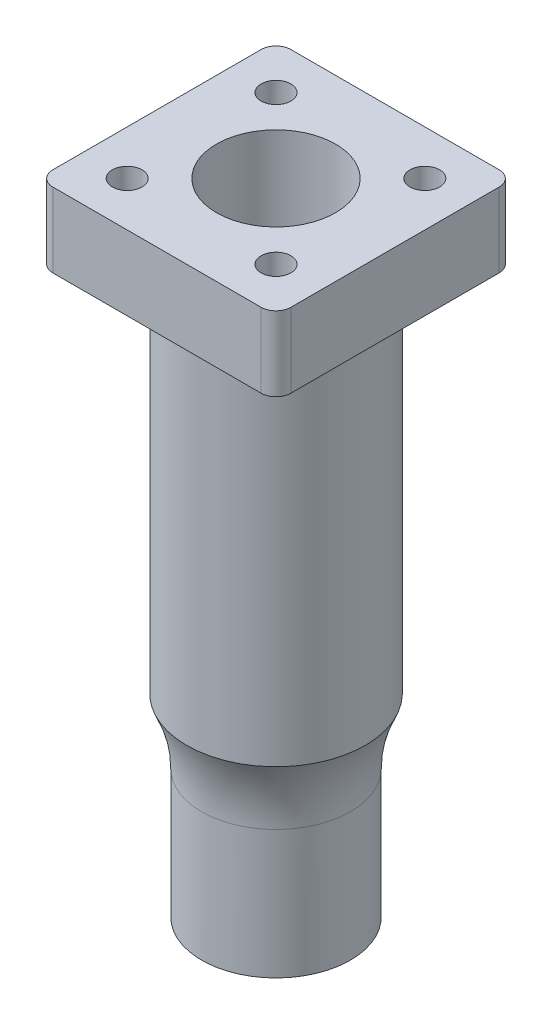
ISO-10303-21;
HEADER;
FILE_DESCRIPTION(('STEP AP214'),'2;1');
FILE_NAME('part.step','',(''),(''),'','','');
FILE_SCHEMA(('AUTOMOTIVE_DESIGN { 1 0 10303 214 1 1 1 1 }'));
ENDSEC;
DATA;
#1=APPLICATION_CONTEXT('core data for automotive mechanical design processes');
#2=APPLICATION_PROTOCOL_DEFINITION('international standard','automotive_design',2000,#1);
#3=PRODUCT_CONTEXT('',#1,'mechanical');
#4=PRODUCT('Part','Part','',(#3));
#5=PRODUCT_RELATED_PRODUCT_CATEGORY('part','',(#4));
#6=PRODUCT_DEFINITION_FORMATION('','',#4);
#7=PRODUCT_DEFINITION_CONTEXT('part definition',#1,'design');
#8=PRODUCT_DEFINITION('design','',#6,#7);
#9=PRODUCT_DEFINITION_SHAPE('','',#8);
#10=(LENGTH_UNIT() NAMED_UNIT(*) SI_UNIT(.MILLI.,.METRE.));
#11=(NAMED_UNIT(*) PLANE_ANGLE_UNIT() SI_UNIT($,.RADIAN.));
#12=(NAMED_UNIT(*) SI_UNIT($,.STERADIAN.) SOLID_ANGLE_UNIT());
#13=UNCERTAINTY_MEASURE_WITH_UNIT(LENGTH_MEASURE(1.E-05),#10,'distance_accuracy_value','');
#14=(GEOMETRIC_REPRESENTATION_CONTEXT(3) GLOBAL_UNCERTAINTY_ASSIGNED_CONTEXT((#13)) GLOBAL_UNIT_ASSIGNED_CONTEXT((#10,
#11,#12)) REPRESENTATION_CONTEXT('',''));
#15=CARTESIAN_POINT('',(0.,0.,0.));
#16=DIRECTION('',(0.,0.,1.));
#17=DIRECTION('',(1.,0.,0.));
#18=AXIS2_PLACEMENT_3D('',#15,#16,#17);
#19=CARTESIAN_POINT('',(0.,33.,0.));
#20=DIRECTION('',(0.,-1.,0.));
#21=DIRECTION('',(0.,0.,-1.));
#22=AXIS2_PLACEMENT_3D('',#19,#20,#21);
#23=CYLINDRICAL_SURFACE('',#22,6.);
#24=CARTESIAN_POINT('',(0.,3.,0.));
#25=DIRECTION('',(0.,1.,0.));
#26=DIRECTION('',(0.,0.,1.));
#27=AXIS2_PLACEMENT_3D('',#24,#25,#26);
#28=CIRCLE('',#27,6.);
#29=CARTESIAN_POINT('',(0.,3.,6.));
#30=VERTEX_POINT('',#29);
#31=EDGE_CURVE('E175',#30,#30,#28,.T.);
#32=ORIENTED_EDGE('',*,*,#31,.T.);
#33=EDGE_LOOP('',(#32));
#34=FACE_BOUND('',#33,.T.);
#35=CARTESIAN_POINT('',(0.,28.,0.));
#36=DIRECTION('',(0.,1.,0.));
#37=DIRECTION('',(0.,0.,1.));
#38=AXIS2_PLACEMENT_3D('',#35,#36,#37);
#39=CIRCLE('',#38,6.);
#40=CARTESIAN_POINT('',(0.,28.,6.));
#41=VERTEX_POINT('',#40);
#42=EDGE_CURVE('E11',#41,#41,#39,.T.);
#43=ORIENTED_EDGE('',*,*,#42,.F.);
#44=EDGE_LOOP('',(#43));
#45=FACE_BOUND('',#44,.T.);
#46=ADVANCED_FACE('F39',(#34,#45),#23,.T.);
#47=CARTESIAN_POINT('',(0.,3.,0.));
#48=DIRECTION('',(0.,1.,0.));
#49=DIRECTION('',(0.,0.,1.));
#50=AXIS2_PLACEMENT_3D('',#47,#48,#49);
#51=PLANE('',#50);
#52=CARTESIAN_POINT('',(0.,3.,0.));
#53=DIRECTION('',(0.,1.,0.));
#54=DIRECTION('',(0.,0.,1.));
#55=AXIS2_PLACEMENT_3D('',#52,#53,#54);
#56=CIRCLE('',#55,2.25);
#57=CARTESIAN_POINT('',(0.,3.,2.25));
#58=VERTEX_POINT('',#57);
#59=EDGE_CURVE('E188',#58,#58,#56,.T.);
#60=ORIENTED_EDGE('',*,*,#59,.F.);
#61=EDGE_LOOP('',(#60));
#62=FACE_BOUND('',#61,.T.);
#63=CARTESIAN_POINT('',(0.,3.,0.));
#64=DIRECTION('',(0.,1.,0.));
#65=DIRECTION('',(0.,0.,1.));
#66=AXIS2_PLACEMENT_3D('',#63,#64,#65);
#67=CIRCLE('',#66,4.);
#68=CARTESIAN_POINT('',(0.,3.,4.));
#69=VERTEX_POINT('',#68);
#70=EDGE_CURVE('E191',#69,#69,#67,.F.);
#71=ORIENTED_EDGE('',*,*,#70,.F.);
#72=EDGE_LOOP('',(#71));
#73=FACE_BOUND('',#72,.T.);
#74=ADVANCED_FACE('F209',(#62,#73),#51,.T.);
#75=CARTESIAN_POINT('',(0.,0.,0.));
#76=DIRECTION('',(0.,1.,0.));
#77=DIRECTION('',(0.,0.,1.));
#78=AXIS2_PLACEMENT_3D('',#75,#76,#77);
#79=PLANE('',#78);
#80=CARTESIAN_POINT('',(0.,0.,0.));
#81=DIRECTION('',(0.,1.,0.));
#82=DIRECTION('',(0.,0.,1.));
#83=AXIS2_PLACEMENT_3D('',#80,#81,#82);
#84=CIRCLE('',#83,2.25);
#85=CARTESIAN_POINT('',(0.,0.,2.25));
#86=VERTEX_POINT('',#85);
#87=EDGE_CURVE('E187',#86,#86,#84,.T.);
#88=ORIENTED_EDGE('',*,*,#87,.T.);
#89=EDGE_LOOP('',(#88));
#90=FACE_BOUND('',#89,.T.);
#91=CARTESIAN_POINT('',(0.,0.,0.));
#92=DIRECTION('',(0.,-1.,0.));
#93=DIRECTION('',(0.,0.,-1.));
#94=AXIS2_PLACEMENT_3D('',#91,#92,#93);
#95=CIRCLE('',#94,3.);
#96=CARTESIAN_POINT('',(0.,0.,-3.));
#97=VERTEX_POINT('',#96);
#98=EDGE_CURVE('E178',#97,#97,#95,.T.);
#99=ORIENTED_EDGE('',*,*,#98,.T.);
#100=EDGE_LOOP('',(#99));
#101=FACE_BOUND('',#100,.T.);
#102=ADVANCED_FACE('F268',(#90,#101),#79,.F.);
#103=CARTESIAN_POINT('',(0.,3.,0.));
#104=DIRECTION('',(0.,-1.,0.));
#105=DIRECTION('',(0.,0.,-1.));
#106=AXIS2_PLACEMENT_3D('',#103,#104,#105);
#107=CYLINDRICAL_SURFACE('',#106,5.);
#108=CARTESIAN_POINT('',(0.,-1.35889894354068,0.));
#109=DIRECTION('',(0.,1.,0.));
#110=DIRECTION('',(0.,0.,1.));
#111=AXIS2_PLACEMENT_3D('',#108,#109,#110);
#112=CIRCLE('',#111,5.);
#113=CARTESIAN_POINT('',(0.,-1.35889894354068,5.));
#114=VERTEX_POINT('',#113);
#115=EDGE_CURVE('E43',#114,#114,#112,.F.);
#116=ORIENTED_EDGE('',*,*,#115,.T.);
#117=EDGE_LOOP('',(#116));
#118=FACE_BOUND('',#117,.T.);
#119=CARTESIAN_POINT('',(0.,-10.,0.));
#120=DIRECTION('',(0.,-1.,0.));
#121=DIRECTION('',(0.,0.,-1.));
#122=AXIS2_PLACEMENT_3D('',#119,#120,#121);
#123=CIRCLE('',#122,5.);
#124=CARTESIAN_POINT('',(0.,-10.,-5.));
#125=VERTEX_POINT('',#124);
#126=EDGE_CURVE('E182',#125,#125,#123,.T.);
#127=ORIENTED_EDGE('',*,*,#126,.F.);
#128=EDGE_LOOP('',(#127));
#129=FACE_BOUND('',#128,.T.);
#130=ADVANCED_FACE('F199',(#118,#129),#107,.T.);
#131=CARTESIAN_POINT('',(0.,3.,0.));
#132=DIRECTION('',(0.,-1.,0.));
#133=DIRECTION('',(0.,0.,-1.));
#134=AXIS2_PLACEMENT_3D('',#131,#132,#133);
#135=CYLINDRICAL_SURFACE('',#134,2.25);
#136=ORIENTED_EDGE('',*,*,#59,.T.);
#137=EDGE_LOOP('',(#136));
#138=FACE_BOUND('',#137,.T.);
#139=ORIENTED_EDGE('',*,*,#87,.F.);
#140=EDGE_LOOP('',(#139));
#141=FACE_BOUND('',#140,.T.);
#142=ADVANCED_FACE('F261',(#138,#141),#135,.F.);
#143=CARTESIAN_POINT('',(0.,-10.,0.));
#144=DIRECTION('',(0.,-1.,0.));
#145=DIRECTION('',(0.,0.,-1.));
#146=AXIS2_PLACEMENT_3D('',#143,#144,#145);
#147=PLANE('',#146);
#148=ORIENTED_EDGE('',*,*,#126,.T.);
#149=EDGE_LOOP('',(#148));
#150=FACE_BOUND('',#149,.T.);
#151=CARTESIAN_POINT('',(0.,-10.,0.));
#152=DIRECTION('',(0.,-1.,0.));
#153=DIRECTION('',(0.,0.,-1.));
#154=AXIS2_PLACEMENT_3D('',#151,#152,#153);
#155=CIRCLE('',#154,3.);
#156=CARTESIAN_POINT('',(0.,-10.,-3.));
#157=VERTEX_POINT('',#156);
#158=EDGE_CURVE('E179',#157,#157,#155,.T.);
#159=ORIENTED_EDGE('',*,*,#158,.F.);
#160=EDGE_LOOP('',(#159));
#161=FACE_BOUND('',#160,.T.);
#162=ADVANCED_FACE('F257',(#150,#161),#147,.T.);
#163=CARTESIAN_POINT('',(0.,-10.,0.));
#164=DIRECTION('',(0.,1.,0.));
#165=DIRECTION('',(0.,0.,1.));
#166=AXIS2_PLACEMENT_3D('',#163,#164,#165);
#167=CYLINDRICAL_SURFACE('',#166,3.);
#168=ORIENTED_EDGE('',*,*,#158,.T.);
#169=EDGE_LOOP('',(#168));
#170=FACE_BOUND('',#169,.T.);
#171=ORIENTED_EDGE('',*,*,#98,.F.);
#172=EDGE_LOOP('',(#171));
#173=FACE_BOUND('',#172,.T.);
#174=ADVANCED_FACE('F252',(#170,#173),#167,.F.);
#175=CARTESIAN_POINT('',(0.,33.,0.));
#176=DIRECTION('',(0.,1.,0.));
#177=DIRECTION('',(0.,0.,1.));
#178=AXIS2_PLACEMENT_3D('',#175,#176,#177);
#179=PLANE('',#178);
#180=CARTESIAN_POINT('',(0.,33.,0.));
#181=DIRECTION('',(0.,1.,0.));
#182=DIRECTION('',(0.,0.,1.));
#183=AXIS2_PLACEMENT_3D('',#180,#181,#182);
#184=CIRCLE('',#183,4.);
#185=CARTESIAN_POINT('',(0.,33.,4.));
#186=VERTEX_POINT('',#185);
#187=EDGE_CURVE('E163',#186,#186,#184,.T.);
#188=ORIENTED_EDGE('',*,*,#187,.F.);
#189=EDGE_LOOP('',(#188));
#190=FACE_BOUND('',#189,.T.);
#191=DIRECTION('',(0.,0.,1.));
#192=VECTOR('',#191,1.);
#193=CARTESIAN_POINT('',(-8.,33.,0.));
#194=LINE('',#193,#192);
#195=CARTESIAN_POINT('',(-8.,33.,-7.));
#196=VERTEX_POINT('',#195);
#197=CARTESIAN_POINT('',(-8.,33.,7.));
#198=VERTEX_POINT('',#197);
#199=EDGE_CURVE('E160',#196,#198,#194,.T.);
#200=ORIENTED_EDGE('',*,*,#199,.T.);
#201=CARTESIAN_POINT('',(-7.,33.,7.));
#202=DIRECTION('',(0.,1.,0.));
#203=DIRECTION('',(0.,0.,-1.));
#204=AXIS2_PLACEMENT_3D('',#201,#202,#203);
#205=CIRCLE('',#204,1.);
#206=CARTESIAN_POINT('',(-7.,33.,8.));
#207=VERTEX_POINT('',#206);
#208=EDGE_CURVE('E142',#198,#207,#205,.T.);
#209=ORIENTED_EDGE('',*,*,#208,.T.);
#210=DIRECTION('',(1.,0.,0.));
#211=VECTOR('',#210,1.);
#212=CARTESIAN_POINT('',(7.,33.,8.));
#213=LINE('',#212,#211);
#214=CARTESIAN_POINT('',(7.,33.,8.));
#215=VERTEX_POINT('',#214);
#216=EDGE_CURVE('E145',#207,#215,#213,.T.);
#217=ORIENTED_EDGE('',*,*,#216,.T.);
#218=CARTESIAN_POINT('',(7.,33.,7.));
#219=DIRECTION('',(0.,1.,0.));
#220=DIRECTION('',(0.,0.,1.));
#221=AXIS2_PLACEMENT_3D('',#218,#219,#220);
#222=CIRCLE('',#221,1.);
#223=CARTESIAN_POINT('',(8.,33.,7.));
#224=VERTEX_POINT('',#223);
#225=EDGE_CURVE('E149',#215,#224,#222,.T.);
#226=ORIENTED_EDGE('',*,*,#225,.T.);
#227=DIRECTION('',(0.,0.,-1.));
#228=VECTOR('',#227,1.);
#229=CARTESIAN_POINT('',(8.,33.,-7.));
#230=LINE('',#229,#228);
#231=CARTESIAN_POINT('',(8.,33.,-7.));
#232=VERTEX_POINT('',#231);
#233=EDGE_CURVE('E152',#224,#232,#230,.T.);
#234=ORIENTED_EDGE('',*,*,#233,.T.);
#235=CARTESIAN_POINT('',(7.,33.,-7.));
#236=DIRECTION('',(0.,1.,0.));
#237=DIRECTION('',(0.,0.,1.));
#238=AXIS2_PLACEMENT_3D('',#235,#236,#237);
#239=CIRCLE('',#238,1.);
#240=CARTESIAN_POINT('',(7.,33.,-8.));
#241=VERTEX_POINT('',#240);
#242=EDGE_CURVE('E155',#232,#241,#239,.T.);
#243=ORIENTED_EDGE('',*,*,#242,.T.);
#244=DIRECTION('',(-1.,0.,0.));
#245=VECTOR('',#244,1.);
#246=CARTESIAN_POINT('',(-7.,33.,-8.));
#247=LINE('',#246,#245);
#248=CARTESIAN_POINT('',(-7.,33.,-8.));
#249=VERTEX_POINT('',#248);
#250=EDGE_CURVE('E119',#241,#249,#247,.T.);
#251=ORIENTED_EDGE('',*,*,#250,.T.);
#252=CARTESIAN_POINT('',(-7.,33.,-7.));
#253=DIRECTION('',(0.,1.,0.));
#254=DIRECTION('',(0.,0.,1.));
#255=AXIS2_PLACEMENT_3D('',#252,#253,#254);
#256=CIRCLE('',#255,1.);
#257=EDGE_CURVE('E158',#249,#196,#256,.T.);
#258=ORIENTED_EDGE('',*,*,#257,.T.);
#259=EDGE_LOOP('',(#200,#209,#217,#226,#234,#243,#251,#258));
#260=FACE_BOUND('',#259,.T.);
#261=CARTESIAN_POINT('',(-5.,33.,-5.));
#262=DIRECTION('',(0.,1.,0.));
#263=DIRECTION('',(0.,0.,1.));
#264=AXIS2_PLACEMENT_3D('',#261,#262,#263);
#265=CIRCLE('',#264,1.);
#266=CARTESIAN_POINT('',(-5.,33.,-4.));
#267=VERTEX_POINT('',#266);
#268=EDGE_CURVE('E452',#267,#267,#265,.T.);
#269=ORIENTED_EDGE('',*,*,#268,.F.);
#270=EDGE_LOOP('',(#269));
#271=FACE_BOUND('',#270,.T.);
#272=CARTESIAN_POINT('',(5.,33.,-5.));
#273=DIRECTION('',(0.,1.,0.));
#274=DIRECTION('',(0.,0.,1.));
#275=AXIS2_PLACEMENT_3D('',#272,#273,#274);
#276=CIRCLE('',#275,1.);
#277=CARTESIAN_POINT('',(5.,33.,-4.));
#278=VERTEX_POINT('',#277);
#279=EDGE_CURVE('E446',#278,#278,#276,.T.);
#280=ORIENTED_EDGE('',*,*,#279,.F.);
#281=EDGE_LOOP('',(#280));
#282=FACE_BOUND('',#281,.T.);
#283=CARTESIAN_POINT('',(-5.,33.,5.));
#284=DIRECTION('',(0.,1.,0.));
#285=DIRECTION('',(0.,0.,1.));
#286=AXIS2_PLACEMENT_3D('',#283,#284,#285);
#287=CIRCLE('',#286,1.);
#288=CARTESIAN_POINT('',(-5.,33.,6.));
#289=VERTEX_POINT('',#288);
#290=EDGE_CURVE('E440',#289,#289,#287,.T.);
#291=ORIENTED_EDGE('',*,*,#290,.F.);
#292=EDGE_LOOP('',(#291));
#293=FACE_BOUND('',#292,.T.);
#294=CARTESIAN_POINT('',(5.,33.,5.));
#295=DIRECTION('',(0.,1.,0.));
#296=DIRECTION('',(0.,0.,1.));
#297=AXIS2_PLACEMENT_3D('',#294,#295,#296);
#298=CIRCLE('',#297,1.);
#299=CARTESIAN_POINT('',(5.,33.,6.));
#300=VERTEX_POINT('',#299);
#301=EDGE_CURVE('E437',#300,#300,#298,.T.);
#302=ORIENTED_EDGE('',*,*,#301,.F.);
#303=EDGE_LOOP('',(#302));
#304=FACE_BOUND('',#303,.T.);
#305=ADVANCED_FACE('F249',(#190,#260,#271,#282,#293,#304),#179,.T.);
#306=CARTESIAN_POINT('',(0.,33.,0.));
#307=DIRECTION('',(0.,-1.,0.));
#308=DIRECTION('',(0.,0.,-1.));
#309=AXIS2_PLACEMENT_3D('',#306,#307,#308);
#310=CYLINDRICAL_SURFACE('',#309,4.);
#311=ORIENTED_EDGE('',*,*,#187,.T.);
#312=EDGE_LOOP('',(#311));
#313=FACE_BOUND('',#312,.T.);
#314=ORIENTED_EDGE('',*,*,#70,.T.);
#315=EDGE_LOOP('',(#314));
#316=FACE_BOUND('',#315,.T.);
#317=ADVANCED_FACE('F204',(#313,#316),#310,.F.);
#318=CARTESIAN_POINT('',(0.,-1.35889894354068,0.));
#319=DIRECTION('',(0.,1.,0.));
#320=DIRECTION('',(0.,0.,1.));
#321=AXIS2_PLACEMENT_3D('',#318,#319,#320);
#322=TOROIDAL_SURFACE('',#321,15.,10.);
#323=ORIENTED_EDGE('',*,*,#115,.F.);
#324=EDGE_LOOP('',(#323));
#325=FACE_BOUND('',#324,.T.);
#326=ORIENTED_EDGE('',*,*,#31,.F.);
#327=EDGE_LOOP('',(#326));
#328=FACE_BOUND('',#327,.T.);
#329=ADVANCED_FACE('F41',(#325,#328),#322,.F.);
#330=CARTESIAN_POINT('',(-7.,28.,-7.));
#331=DIRECTION('',(0.,1.,0.));
#332=DIRECTION('',(0.,0.,1.));
#333=AXIS2_PLACEMENT_3D('',#330,#331,#332);
#334=PLANE('',#333);
#335=DIRECTION('',(0.,0.,1.));
#336=VECTOR('',#335,1.);
#337=CARTESIAN_POINT('',(-8.,28.,7.));
#338=LINE('',#337,#336);
#339=CARTESIAN_POINT('',(-8.,28.,-7.));
#340=VERTEX_POINT('',#339);
#341=CARTESIAN_POINT('',(-8.,28.,7.));
#342=VERTEX_POINT('',#341);
#343=EDGE_CURVE('E57',#340,#342,#338,.T.);
#344=ORIENTED_EDGE('',*,*,#343,.F.);
#345=CARTESIAN_POINT('',(-7.,28.,-7.));
#346=DIRECTION('',(0.,1.,0.));
#347=DIRECTION('',(0.,0.,1.));
#348=AXIS2_PLACEMENT_3D('',#345,#346,#347);
#349=CIRCLE('',#348,1.);
#350=CARTESIAN_POINT('',(-7.,28.,-8.));
#351=VERTEX_POINT('',#350);
#352=EDGE_CURVE('E132',#351,#340,#349,.T.);
#353=ORIENTED_EDGE('',*,*,#352,.F.);
#354=DIRECTION('',(-1.,0.,0.));
#355=VECTOR('',#354,1.);
#356=CARTESIAN_POINT('',(-7.,28.,-8.));
#357=LINE('',#356,#355);
#358=CARTESIAN_POINT('',(7.,28.,-8.));
#359=VERTEX_POINT('',#358);
#360=EDGE_CURVE('E117',#359,#351,#357,.T.);
#361=ORIENTED_EDGE('',*,*,#360,.F.);
#362=CARTESIAN_POINT('',(7.,28.,-7.));
#363=DIRECTION('',(0.,1.,0.));
#364=DIRECTION('',(0.,0.,1.));
#365=AXIS2_PLACEMENT_3D('',#362,#363,#364);
#366=CIRCLE('',#365,1.);
#367=CARTESIAN_POINT('',(8.,28.,-7.));
#368=VERTEX_POINT('',#367);
#369=EDGE_CURVE('E130',#368,#359,#366,.T.);
#370=ORIENTED_EDGE('',*,*,#369,.F.);
#371=DIRECTION('',(0.,0.,-1.));
#372=VECTOR('',#371,1.);
#373=CARTESIAN_POINT('',(8.,28.,-7.));
#374=LINE('',#373,#372);
#375=CARTESIAN_POINT('',(8.,28.,7.));
#376=VERTEX_POINT('',#375);
#377=EDGE_CURVE('E135',#376,#368,#374,.T.);
#378=ORIENTED_EDGE('',*,*,#377,.F.);
#379=CARTESIAN_POINT('',(7.,28.,7.));
#380=DIRECTION('',(0.,1.,0.));
#381=DIRECTION('',(0.,0.,1.));
#382=AXIS2_PLACEMENT_3D('',#379,#380,#381);
#383=CIRCLE('',#382,1.);
#384=CARTESIAN_POINT('',(7.,28.,8.));
#385=VERTEX_POINT('',#384);
#386=EDGE_CURVE('E137',#385,#376,#383,.T.);
#387=ORIENTED_EDGE('',*,*,#386,.F.);
#388=DIRECTION('',(1.,0.,0.));
#389=VECTOR('',#388,1.);
#390=CARTESIAN_POINT('',(7.,28.,8.));
#391=LINE('',#390,#389);
#392=CARTESIAN_POINT('',(-7.,28.,8.));
#393=VERTEX_POINT('',#392);
#394=EDGE_CURVE('E462',#393,#385,#391,.T.);
#395=ORIENTED_EDGE('',*,*,#394,.F.);
#396=CARTESIAN_POINT('',(-7.,28.,7.));
#397=DIRECTION('',(0.,1.,0.));
#398=DIRECTION('',(0.,0.,-1.));
#399=AXIS2_PLACEMENT_3D('',#396,#397,#398);
#400=CIRCLE('',#399,1.);
#401=EDGE_CURVE('E460',#342,#393,#400,.T.);
#402=ORIENTED_EDGE('',*,*,#401,.F.);
#403=EDGE_LOOP('',(#344,#353,#361,#370,#378,#387,#395,#402));
#404=FACE_BOUND('',#403,.T.);
#405=CARTESIAN_POINT('',(-5.,28.,-5.));
#406=DIRECTION('',(0.,1.,0.));
#407=DIRECTION('',(0.,0.,1.));
#408=AXIS2_PLACEMENT_3D('',#405,#406,#407);
#409=CIRCLE('',#408,1.);
#410=CARTESIAN_POINT('',(-5.,28.,-4.));
#411=VERTEX_POINT('',#410);
#412=EDGE_CURVE('E146',#411,#411,#409,.T.);
#413=ORIENTED_EDGE('',*,*,#412,.T.);
#414=EDGE_LOOP('',(#413));
#415=FACE_BOUND('',#414,.T.);
#416=CARTESIAN_POINT('',(5.,28.,-5.));
#417=DIRECTION('',(0.,1.,0.));
#418=DIRECTION('',(0.,0.,1.));
#419=AXIS2_PLACEMENT_3D('',#416,#417,#418);
#420=CIRCLE('',#419,1.);
#421=CARTESIAN_POINT('',(5.,28.,-4.));
#422=VERTEX_POINT('',#421);
#423=EDGE_CURVE('E449',#422,#422,#420,.T.);
#424=ORIENTED_EDGE('',*,*,#423,.T.);
#425=EDGE_LOOP('',(#424));
#426=FACE_BOUND('',#425,.T.);
#427=CARTESIAN_POINT('',(-5.,28.,5.));
#428=DIRECTION('',(0.,1.,0.));
#429=DIRECTION('',(0.,0.,1.));
#430=AXIS2_PLACEMENT_3D('',#427,#428,#429);
#431=CIRCLE('',#430,1.);
#432=CARTESIAN_POINT('',(-5.,28.,6.));
#433=VERTEX_POINT('',#432);
#434=EDGE_CURVE('E443',#433,#433,#431,.T.);
#435=ORIENTED_EDGE('',*,*,#434,.T.);
#436=EDGE_LOOP('',(#435));
#437=FACE_BOUND('',#436,.T.);
#438=CARTESIAN_POINT('',(5.,28.,5.));
#439=DIRECTION('',(0.,1.,0.));
#440=DIRECTION('',(0.,0.,1.));
#441=AXIS2_PLACEMENT_3D('',#438,#439,#440);
#442=CIRCLE('',#441,1.);
#443=CARTESIAN_POINT('',(5.,28.,6.));
#444=VERTEX_POINT('',#443);
#445=EDGE_CURVE('E434',#444,#444,#442,.T.);
#446=ORIENTED_EDGE('',*,*,#445,.T.);
#447=EDGE_LOOP('',(#446));
#448=FACE_BOUND('',#447,.T.);
#449=ORIENTED_EDGE('',*,*,#42,.T.);
#450=EDGE_LOOP('',(#449));
#451=FACE_BOUND('',#450,.T.);
#452=ADVANCED_FACE('F127',(#404,#415,#426,#437,#448,#451),#334,.F.);
#453=CARTESIAN_POINT('',(-8.,28.,0.));
#454=DIRECTION('',(-1.,0.,0.));
#455=DIRECTION('',(0.,0.,1.));
#456=AXIS2_PLACEMENT_3D('',#453,#454,#455);
#457=PLANE('',#456);
#458=ORIENTED_EDGE('',*,*,#199,.F.);
#459=DIRECTION('',(0.,1.,0.));
#460=VECTOR('',#459,1.);
#461=CARTESIAN_POINT('',(-8.,28.,-7.));
#462=LINE('',#461,#460);
#463=EDGE_CURVE('E92',#340,#196,#462,.T.);
#464=ORIENTED_EDGE('',*,*,#463,.F.);
#465=ORIENTED_EDGE('',*,*,#343,.T.);
#466=DIRECTION('',(0.,1.,0.));
#467=VECTOR('',#466,1.);
#468=CARTESIAN_POINT('',(-8.,28.,7.));
#469=LINE('',#468,#467);
#470=EDGE_CURVE('E101',#342,#198,#469,.T.);
#471=ORIENTED_EDGE('',*,*,#470,.T.);
#472=EDGE_LOOP('',(#458,#464,#465,#471));
#473=FACE_BOUND('',#472,.T.);
#474=ADVANCED_FACE('F214',(#473),#457,.T.);
#475=CARTESIAN_POINT('',(-7.,28.,-7.));
#476=DIRECTION('',(0.,1.,0.));
#477=DIRECTION('',(0.,0.,1.));
#478=AXIS2_PLACEMENT_3D('',#475,#476,#477);
#479=CYLINDRICAL_SURFACE('',#478,1.);
#480=ORIENTED_EDGE('',*,*,#257,.F.);
#481=DIRECTION('',(0.,1.,0.));
#482=VECTOR('',#481,1.);
#483=CARTESIAN_POINT('',(-7.,28.,-8.));
#484=LINE('',#483,#482);
#485=EDGE_CURVE('E86',#351,#249,#484,.T.);
#486=ORIENTED_EDGE('',*,*,#485,.F.);
#487=ORIENTED_EDGE('',*,*,#352,.T.);
#488=ORIENTED_EDGE('',*,*,#463,.T.);
#489=EDGE_LOOP('',(#480,#486,#487,#488));
#490=FACE_BOUND('',#489,.T.);
#491=ADVANCED_FACE('F220',(#490),#479,.T.);
#492=CARTESIAN_POINT('',(-7.,28.,-8.));
#493=DIRECTION('',(0.,0.,-1.));
#494=DIRECTION('',(-1.,0.,0.));
#495=AXIS2_PLACEMENT_3D('',#492,#493,#494);
#496=PLANE('',#495);
#497=ORIENTED_EDGE('',*,*,#250,.F.);
#498=DIRECTION('',(0.,1.,0.));
#499=VECTOR('',#498,1.);
#500=CARTESIAN_POINT('',(7.,28.,-8.));
#501=LINE('',#500,#499);
#502=EDGE_CURVE('E114',#359,#241,#501,.T.);
#503=ORIENTED_EDGE('',*,*,#502,.F.);
#504=ORIENTED_EDGE('',*,*,#360,.T.);
#505=ORIENTED_EDGE('',*,*,#485,.T.);
#506=EDGE_LOOP('',(#497,#503,#504,#505));
#507=FACE_BOUND('',#506,.T.);
#508=ADVANCED_FACE('F116',(#507),#496,.T.);
#509=CARTESIAN_POINT('',(7.,28.,-7.));
#510=DIRECTION('',(0.,1.,0.));
#511=DIRECTION('',(0.,0.,1.));
#512=AXIS2_PLACEMENT_3D('',#509,#510,#511);
#513=CYLINDRICAL_SURFACE('',#512,1.);
#514=ORIENTED_EDGE('',*,*,#242,.F.);
#515=DIRECTION('',(0.,1.,0.));
#516=VECTOR('',#515,1.);
#517=CARTESIAN_POINT('',(8.,28.,-7.));
#518=LINE('',#517,#516);
#519=EDGE_CURVE('E124',#368,#232,#518,.T.);
#520=ORIENTED_EDGE('',*,*,#519,.F.);
#521=ORIENTED_EDGE('',*,*,#369,.T.);
#522=ORIENTED_EDGE('',*,*,#502,.T.);
#523=EDGE_LOOP('',(#514,#520,#521,#522));
#524=FACE_BOUND('',#523,.T.);
#525=ADVANCED_FACE('F134',(#524),#513,.T.);
#526=CARTESIAN_POINT('',(8.,28.,-7.));
#527=DIRECTION('',(1.,0.,0.));
#528=DIRECTION('',(0.,0.,-1.));
#529=AXIS2_PLACEMENT_3D('',#526,#527,#528);
#530=PLANE('',#529);
#531=ORIENTED_EDGE('',*,*,#233,.F.);
#532=DIRECTION('',(0.,1.,0.));
#533=VECTOR('',#532,1.);
#534=CARTESIAN_POINT('',(8.,28.,7.));
#535=LINE('',#534,#533);
#536=EDGE_CURVE('E166',#376,#224,#535,.T.);
#537=ORIENTED_EDGE('',*,*,#536,.F.);
#538=ORIENTED_EDGE('',*,*,#377,.T.);
#539=ORIENTED_EDGE('',*,*,#519,.T.);
#540=EDGE_LOOP('',(#531,#537,#538,#539));
#541=FACE_BOUND('',#540,.T.);
#542=ADVANCED_FACE('F233',(#541),#530,.T.);
#543=CARTESIAN_POINT('',(7.,28.,7.));
#544=DIRECTION('',(0.,1.,0.));
#545=DIRECTION('',(0.,0.,1.));
#546=AXIS2_PLACEMENT_3D('',#543,#544,#545);
#547=CYLINDRICAL_SURFACE('',#546,1.);
#548=ORIENTED_EDGE('',*,*,#225,.F.);
#549=DIRECTION('',(0.,1.,0.));
#550=VECTOR('',#549,1.);
#551=CARTESIAN_POINT('',(7.,28.,8.));
#552=LINE('',#551,#550);
#553=EDGE_CURVE('E168',#385,#215,#552,.T.);
#554=ORIENTED_EDGE('',*,*,#553,.F.);
#555=ORIENTED_EDGE('',*,*,#386,.T.);
#556=ORIENTED_EDGE('',*,*,#536,.T.);
#557=EDGE_LOOP('',(#548,#554,#555,#556));
#558=FACE_BOUND('',#557,.T.);
#559=ADVANCED_FACE('F236',(#558),#547,.T.);
#560=CARTESIAN_POINT('',(7.,28.,8.));
#561=DIRECTION('',(0.,0.,1.));
#562=DIRECTION('',(1.,0.,0.));
#563=AXIS2_PLACEMENT_3D('',#560,#561,#562);
#564=PLANE('',#563);
#565=ORIENTED_EDGE('',*,*,#216,.F.);
#566=DIRECTION('',(0.,1.,0.));
#567=VECTOR('',#566,1.);
#568=CARTESIAN_POINT('',(-7.,28.,8.));
#569=LINE('',#568,#567);
#570=EDGE_CURVE('E170',#393,#207,#569,.T.);
#571=ORIENTED_EDGE('',*,*,#570,.F.);
#572=ORIENTED_EDGE('',*,*,#394,.T.);
#573=ORIENTED_EDGE('',*,*,#553,.T.);
#574=EDGE_LOOP('',(#565,#571,#572,#573));
#575=FACE_BOUND('',#574,.T.);
#576=ADVANCED_FACE('F240',(#575),#564,.T.);
#577=CARTESIAN_POINT('',(-7.,28.,7.));
#578=DIRECTION('',(0.,1.,0.));
#579=DIRECTION('',(0.,0.,1.));
#580=AXIS2_PLACEMENT_3D('',#577,#578,#579);
#581=CYLINDRICAL_SURFACE('',#580,1.);
#582=ORIENTED_EDGE('',*,*,#208,.F.);
#583=ORIENTED_EDGE('',*,*,#470,.F.);
#584=ORIENTED_EDGE('',*,*,#401,.T.);
#585=ORIENTED_EDGE('',*,*,#570,.T.);
#586=EDGE_LOOP('',(#582,#583,#584,#585));
#587=FACE_BOUND('',#586,.T.);
#588=ADVANCED_FACE('F244',(#587),#581,.T.);
#589=CARTESIAN_POINT('',(-5.,28.,-5.));
#590=DIRECTION('',(0.,1.,0.));
#591=DIRECTION('',(0.,0.,1.));
#592=AXIS2_PLACEMENT_3D('',#589,#590,#591);
#593=CYLINDRICAL_SURFACE('',#592,1.);
#594=ORIENTED_EDGE('',*,*,#412,.F.);
#595=EDGE_LOOP('',(#594));
#596=FACE_BOUND('',#595,.T.);
#597=ORIENTED_EDGE('',*,*,#268,.T.);
#598=EDGE_LOOP('',(#597));
#599=FACE_BOUND('',#598,.T.);
#600=ADVANCED_FACE('F224',(#596,#599),#593,.F.);
#601=CARTESIAN_POINT('',(5.,28.,-5.));
#602=DIRECTION('',(0.,1.,0.));
#603=DIRECTION('',(0.,0.,1.));
#604=AXIS2_PLACEMENT_3D('',#601,#602,#603);
#605=CYLINDRICAL_SURFACE('',#604,1.);
#606=ORIENTED_EDGE('',*,*,#423,.F.);
#607=EDGE_LOOP('',(#606));
#608=FACE_BOUND('',#607,.T.);
#609=ORIENTED_EDGE('',*,*,#279,.T.);
#610=EDGE_LOOP('',(#609));
#611=FACE_BOUND('',#610,.T.);
#612=ADVANCED_FACE('F400',(#608,#611),#605,.F.);
#613=CARTESIAN_POINT('',(-5.,28.,5.));
#614=DIRECTION('',(0.,1.,0.));
#615=DIRECTION('',(0.,0.,1.));
#616=AXIS2_PLACEMENT_3D('',#613,#614,#615);
#617=CYLINDRICAL_SURFACE('',#616,1.);
#618=ORIENTED_EDGE('',*,*,#434,.F.);
#619=EDGE_LOOP('',(#618));
#620=FACE_BOUND('',#619,.T.);
#621=ORIENTED_EDGE('',*,*,#290,.T.);
#622=EDGE_LOOP('',(#621));
#623=FACE_BOUND('',#622,.T.);
#624=ADVANCED_FACE('F409',(#620,#623),#617,.F.);
#625=CARTESIAN_POINT('',(5.,28.,5.));
#626=DIRECTION('',(0.,1.,0.));
#627=DIRECTION('',(0.,0.,1.));
#628=AXIS2_PLACEMENT_3D('',#625,#626,#627);
#629=CYLINDRICAL_SURFACE('',#628,1.);
#630=ORIENTED_EDGE('',*,*,#445,.F.);
#631=EDGE_LOOP('',(#630));
#632=FACE_BOUND('',#631,.T.);
#633=ORIENTED_EDGE('',*,*,#301,.T.);
#634=EDGE_LOOP('',(#633));
#635=FACE_BOUND('',#634,.T.);
#636=ADVANCED_FACE('F418',(#632,#635),#629,.F.);
#637=CLOSED_SHELL('',(#46,#74,#102,#130,#142,#162,#174,#305,#317,#329,#452,#474,#491,#508,#525,
#542,#559,#576,#588,#600,#612,#624,#636));
#638=MANIFOLD_SOLID_BREP('B2',#637);
#639=ADVANCED_BREP_SHAPE_REPRESENTATION('',(#18,#638),#14);
#640=SHAPE_DEFINITION_REPRESENTATION(#9,#639);
ENDSEC;
END-ISO-10303-21;
